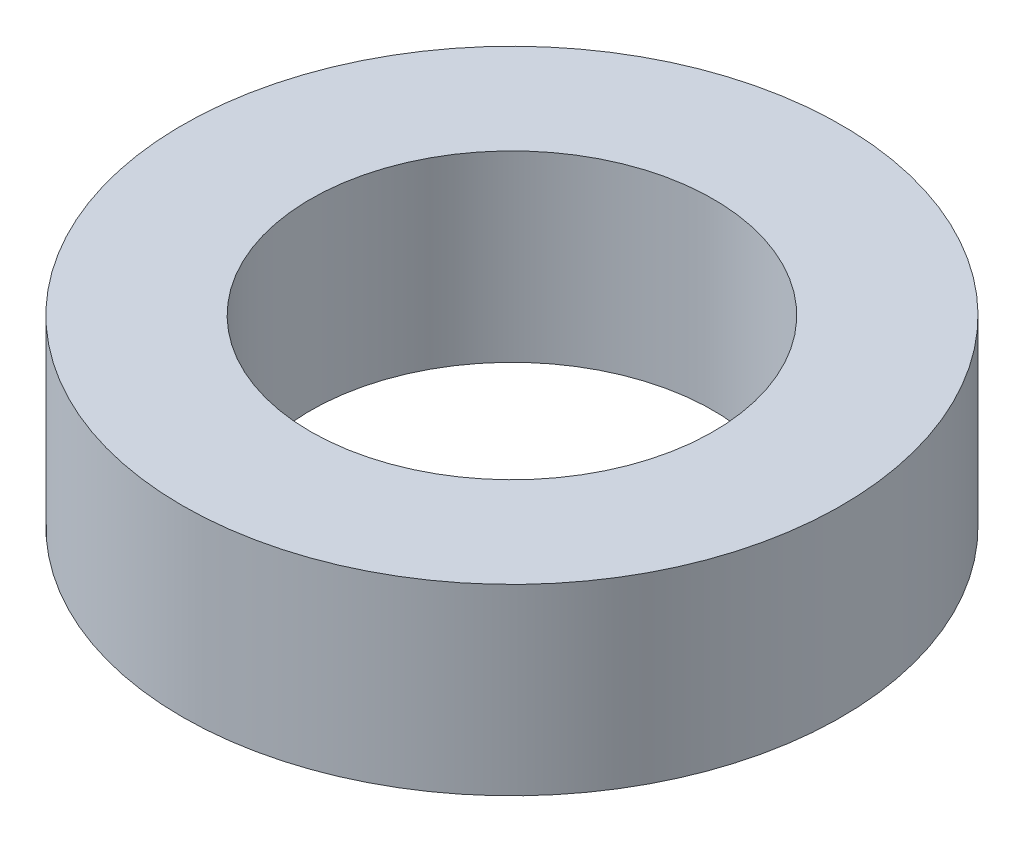
ISO-10303-21;
HEADER;
FILE_DESCRIPTION(('STEP AP214'),'2;1');
FILE_NAME('part.step','',(''),(''),'','','');
FILE_SCHEMA(('AUTOMOTIVE_DESIGN { 1 0 10303 214 1 1 1 1 }'));
ENDSEC;
DATA;
#1=APPLICATION_CONTEXT('core data for automotive mechanical design processes');
#2=APPLICATION_PROTOCOL_DEFINITION('international standard','automotive_design',2000,#1);
#3=PRODUCT_CONTEXT('',#1,'mechanical');
#4=PRODUCT('Part','Part','',(#3));
#5=PRODUCT_RELATED_PRODUCT_CATEGORY('part','',(#4));
#6=PRODUCT_DEFINITION_FORMATION('','',#4);
#7=PRODUCT_DEFINITION_CONTEXT('part definition',#1,'design');
#8=PRODUCT_DEFINITION('design','',#6,#7);
#9=PRODUCT_DEFINITION_SHAPE('','',#8);
#10=(LENGTH_UNIT() NAMED_UNIT(*) SI_UNIT(.MILLI.,.METRE.));
#11=(NAMED_UNIT(*) PLANE_ANGLE_UNIT() SI_UNIT($,.RADIAN.));
#12=(NAMED_UNIT(*) SI_UNIT($,.STERADIAN.) SOLID_ANGLE_UNIT());
#13=UNCERTAINTY_MEASURE_WITH_UNIT(LENGTH_MEASURE(1.E-05),#10,'distance_accuracy_value','');
#14=(GEOMETRIC_REPRESENTATION_CONTEXT(3) GLOBAL_UNCERTAINTY_ASSIGNED_CONTEXT((#13)) GLOBAL_UNIT_ASSIGNED_CONTEXT((#10,
#11,#12)) REPRESENTATION_CONTEXT('',''));
#15=CARTESIAN_POINT('',(0.,0.,0.));
#16=DIRECTION('',(0.,0.,1.));
#17=DIRECTION('',(1.,0.,0.));
#18=AXIS2_PLACEMENT_3D('',#15,#16,#17);
#19=CARTESIAN_POINT('',(0.,5.,0.));
#20=DIRECTION('',(0.,-1.,0.));
#21=DIRECTION('',(0.,0.,-1.));
#22=AXIS2_PLACEMENT_3D('',#19,#20,#21);
#23=CYLINDRICAL_SURFACE('',#22,18.);
#24=CARTESIAN_POINT('',(0.,5.,0.));
#25=DIRECTION('',(0.,1.,0.));
#26=DIRECTION('',(0.,0.,1.));
#27=AXIS2_PLACEMENT_3D('',#24,#25,#26);
#28=CIRCLE('',#27,18.);
#29=CARTESIAN_POINT('',(0.,5.,18.));
#30=VERTEX_POINT('',#29);
#31=EDGE_CURVE('E10',#30,#30,#28,.T.);
#32=ORIENTED_EDGE('',*,*,#31,.F.);
#33=EDGE_LOOP('',(#32));
#34=FACE_BOUND('',#33,.T.);
#35=CARTESIAN_POINT('',(0.,-5.,0.));
#36=DIRECTION('',(0.,1.,0.));
#37=DIRECTION('',(0.,0.,1.));
#38=AXIS2_PLACEMENT_3D('',#35,#36,#37);
#39=CIRCLE('',#38,18.);
#40=CARTESIAN_POINT('',(0.,-5.,18.));
#41=VERTEX_POINT('',#40);
#42=EDGE_CURVE('E36',#41,#41,#39,.T.);
#43=ORIENTED_EDGE('',*,*,#42,.T.);
#44=EDGE_LOOP('',(#43));
#45=FACE_BOUND('',#44,.T.);
#46=ADVANCED_FACE('F33',(#34,#45),#23,.T.);
#47=CARTESIAN_POINT('',(0.,5.,0.));
#48=DIRECTION('',(0.,1.,0.));
#49=DIRECTION('',(0.,0.,1.));
#50=AXIS2_PLACEMENT_3D('',#47,#48,#49);
#51=PLANE('',#50);
#52=CARTESIAN_POINT('',(0.,5.,0.));
#53=DIRECTION('',(0.,1.,0.));
#54=DIRECTION('',(0.,0.,1.));
#55=AXIS2_PLACEMENT_3D('',#52,#53,#54);
#56=CIRCLE('',#55,11.);
#57=CARTESIAN_POINT('',(0.,5.,11.));
#58=VERTEX_POINT('',#57);
#59=EDGE_CURVE('E47',#58,#58,#56,.T.);
#60=ORIENTED_EDGE('',*,*,#59,.F.);
#61=EDGE_LOOP('',(#60));
#62=FACE_BOUND('',#61,.T.);
#63=ORIENTED_EDGE('',*,*,#31,.T.);
#64=EDGE_LOOP('',(#63));
#65=FACE_BOUND('',#64,.T.);
#66=ADVANCED_FACE('F53',(#62,#65),#51,.T.);
#67=CARTESIAN_POINT('',(0.,-5.,0.));
#68=DIRECTION('',(0.,1.,0.));
#69=DIRECTION('',(0.,0.,1.));
#70=AXIS2_PLACEMENT_3D('',#67,#68,#69);
#71=PLANE('',#70);
#72=CARTESIAN_POINT('',(0.,-5.,0.));
#73=DIRECTION('',(0.,1.,0.));
#74=DIRECTION('',(0.,0.,1.));
#75=AXIS2_PLACEMENT_3D('',#72,#73,#74);
#76=CIRCLE('',#75,11.);
#77=CARTESIAN_POINT('',(0.,-5.,11.));
#78=VERTEX_POINT('',#77);
#79=EDGE_CURVE('E43',#78,#78,#76,.T.);
#80=ORIENTED_EDGE('',*,*,#79,.T.);
#81=EDGE_LOOP('',(#80));
#82=FACE_BOUND('',#81,.T.);
#83=ORIENTED_EDGE('',*,*,#42,.F.);
#84=EDGE_LOOP('',(#83));
#85=FACE_BOUND('',#84,.T.);
#86=ADVANCED_FACE('F55',(#82,#85),#71,.F.);
#87=CARTESIAN_POINT('',(0.,5.,0.));
#88=DIRECTION('',(0.,1.,0.));
#89=DIRECTION('',(0.,0.,1.));
#90=AXIS2_PLACEMENT_3D('',#87,#88,#89);
#91=CYLINDRICAL_SURFACE('',#90,11.);
#92=ORIENTED_EDGE('',*,*,#79,.F.);
#93=EDGE_LOOP('',(#92));
#94=FACE_BOUND('',#93,.T.);
#95=ORIENTED_EDGE('',*,*,#59,.T.);
#96=EDGE_LOOP('',(#95));
#97=FACE_BOUND('',#96,.T.);
#98=ADVANCED_FACE('F51',(#94,#97),#91,.F.);
#99=CLOSED_SHELL('',(#46,#66,#86,#98));
#100=MANIFOLD_SOLID_BREP('B2',#99);
#101=ADVANCED_BREP_SHAPE_REPRESENTATION('',(#18,#100),#14);
#102=SHAPE_DEFINITION_REPRESENTATION(#9,#101);
ENDSEC;
END-ISO-10303-21;
